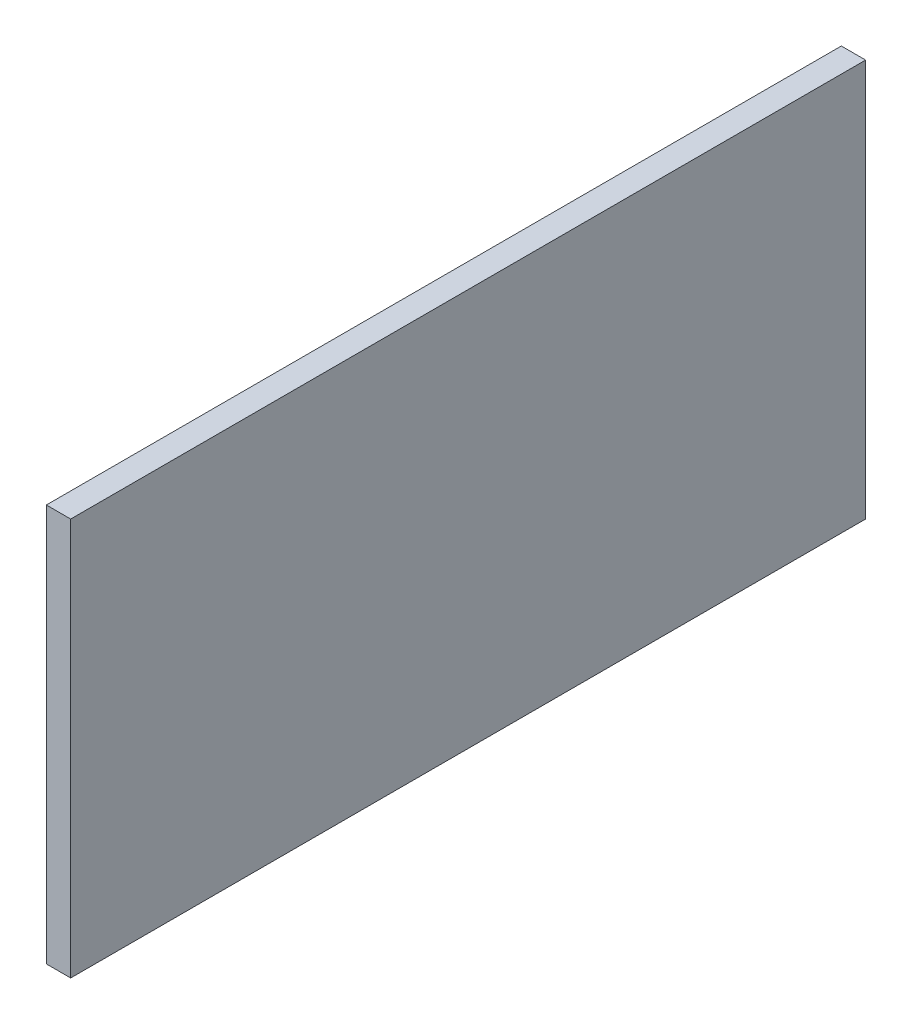
ISO-10303-21;
HEADER;
FILE_DESCRIPTION(('STEP AP214'),'2;1');
FILE_NAME('part.step','',(''),(''),'','','');
FILE_SCHEMA(('AUTOMOTIVE_DESIGN { 1 0 10303 214 1 1 1 1 }'));
ENDSEC;
DATA;
#1=APPLICATION_CONTEXT('core data for automotive mechanical design processes');
#2=APPLICATION_PROTOCOL_DEFINITION('international standard','automotive_design',2000,#1);
#3=PRODUCT_CONTEXT('',#1,'mechanical');
#4=PRODUCT('Part','Part','',(#3));
#5=PRODUCT_RELATED_PRODUCT_CATEGORY('part','',(#4));
#6=PRODUCT_DEFINITION_FORMATION('','',#4);
#7=PRODUCT_DEFINITION_CONTEXT('part definition',#1,'design');
#8=PRODUCT_DEFINITION('design','',#6,#7);
#9=PRODUCT_DEFINITION_SHAPE('','',#8);
#10=(LENGTH_UNIT() NAMED_UNIT(*) SI_UNIT(.MILLI.,.METRE.));
#11=(NAMED_UNIT(*) PLANE_ANGLE_UNIT() SI_UNIT($,.RADIAN.));
#12=(NAMED_UNIT(*) SI_UNIT($,.STERADIAN.) SOLID_ANGLE_UNIT());
#13=UNCERTAINTY_MEASURE_WITH_UNIT(LENGTH_MEASURE(1.E-05),#10,'distance_accuracy_value','');
#14=(GEOMETRIC_REPRESENTATION_CONTEXT(3) GLOBAL_UNCERTAINTY_ASSIGNED_CONTEXT((#13)) GLOBAL_UNIT_ASSIGNED_CONTEXT((#10,
#11,#12)) REPRESENTATION_CONTEXT('',''));
#15=CARTESIAN_POINT('',(0.,0.,0.));
#16=DIRECTION('',(0.,0.,1.));
#17=DIRECTION('',(1.,0.,0.));
#18=AXIS2_PLACEMENT_3D('',#15,#16,#17);
#19=CARTESIAN_POINT('',(12.2428,0.,200.));
#20=DIRECTION('',(0.,0.,-1.));
#21=DIRECTION('',(0.,1.,0.));
#22=AXIS2_PLACEMENT_3D('',#19,#20,#21);
#23=PLANE('',#22);
#24=DIRECTION('',(0.,-1.,0.));
#25=VECTOR('',#24,1.);
#26=CARTESIAN_POINT('',(0.,0.,200.));
#27=LINE('',#26,#25);
#28=CARTESIAN_POINT('',(0.,0.,200.));
#29=VERTEX_POINT('',#28);
#30=CARTESIAN_POINT('',(0.,-200.,200.));
#31=VERTEX_POINT('',#30);
#32=EDGE_CURVE('E95',#29,#31,#27,.T.);
#33=ORIENTED_EDGE('',*,*,#32,.T.);
#34=DIRECTION('',(-1.,0.,0.));
#35=VECTOR('',#34,1.);
#36=CARTESIAN_POINT('',(12.2428,-200.,200.));
#37=LINE('',#36,#35);
#38=CARTESIAN_POINT('',(12.2428,-200.,200.));
#39=VERTEX_POINT('',#38);
#40=EDGE_CURVE('E11',#39,#31,#37,.T.);
#41=ORIENTED_EDGE('',*,*,#40,.F.);
#42=DIRECTION('',(0.,-1.,0.));
#43=VECTOR('',#42,1.);
#44=CARTESIAN_POINT('',(12.2428,0.,200.));
#45=LINE('',#44,#43);
#46=CARTESIAN_POINT('',(12.2428,0.,200.));
#47=VERTEX_POINT('',#46);
#48=EDGE_CURVE('E83',#47,#39,#45,.T.);
#49=ORIENTED_EDGE('',*,*,#48,.F.);
#50=DIRECTION('',(-1.,0.,0.));
#51=VECTOR('',#50,1.);
#52=CARTESIAN_POINT('',(12.2428,0.,200.));
#53=LINE('',#52,#51);
#54=EDGE_CURVE('E91',#47,#29,#53,.T.);
#55=ORIENTED_EDGE('',*,*,#54,.T.);
#56=EDGE_LOOP('',(#33,#41,#49,#55));
#57=FACE_BOUND('',#56,.T.);
#58=ADVANCED_FACE('F32',(#57),#23,.F.);
#59=CARTESIAN_POINT('',(12.2428,-200.,200.));
#60=DIRECTION('',(0.,1.,0.));
#61=DIRECTION('',(0.,0.,1.));
#62=AXIS2_PLACEMENT_3D('',#59,#60,#61);
#63=PLANE('',#62);
#64=DIRECTION('',(0.,0.,-1.));
#65=VECTOR('',#64,1.);
#66=CARTESIAN_POINT('',(0.,-200.,200.));
#67=LINE('',#66,#65);
#68=CARTESIAN_POINT('',(0.,-200.,-200.));
#69=VERTEX_POINT('',#68);
#70=EDGE_CURVE('E87',#31,#69,#67,.T.);
#71=ORIENTED_EDGE('',*,*,#70,.T.);
#72=DIRECTION('',(-1.,0.,0.));
#73=VECTOR('',#72,1.);
#74=CARTESIAN_POINT('',(12.2428,-200.,-200.));
#75=LINE('',#74,#73);
#76=CARTESIAN_POINT('',(12.2428,-200.,-200.));
#77=VERTEX_POINT('',#76);
#78=EDGE_CURVE('E40',#77,#69,#75,.T.);
#79=ORIENTED_EDGE('',*,*,#78,.F.);
#80=DIRECTION('',(0.,0.,-1.));
#81=VECTOR('',#80,1.);
#82=CARTESIAN_POINT('',(12.2428,-200.,200.));
#83=LINE('',#82,#81);
#84=EDGE_CURVE('E78',#39,#77,#83,.T.);
#85=ORIENTED_EDGE('',*,*,#84,.F.);
#86=ORIENTED_EDGE('',*,*,#40,.T.);
#87=EDGE_LOOP('',(#71,#79,#85,#86));
#88=FACE_BOUND('',#87,.T.);
#89=ADVANCED_FACE('F86',(#88),#63,.F.);
#90=CARTESIAN_POINT('',(12.2428,0.,-200.));
#91=DIRECTION('',(0.,0.,1.));
#92=DIRECTION('',(0.,-1.,0.));
#93=AXIS2_PLACEMENT_3D('',#90,#91,#92);
#94=PLANE('',#93);
#95=DIRECTION('',(0.,1.,0.));
#96=VECTOR('',#95,1.);
#97=CARTESIAN_POINT('',(0.,0.,-200.));
#98=LINE('',#97,#96);
#99=CARTESIAN_POINT('',(0.,0.,-200.));
#100=VERTEX_POINT('',#99);
#101=EDGE_CURVE('E65',#69,#100,#98,.T.);
#102=ORIENTED_EDGE('',*,*,#101,.T.);
#103=DIRECTION('',(-1.,0.,0.));
#104=VECTOR('',#103,1.);
#105=CARTESIAN_POINT('',(12.2428,0.,-200.));
#106=LINE('',#105,#104);
#107=CARTESIAN_POINT('',(12.2428,0.,-200.));
#108=VERTEX_POINT('',#107);
#109=EDGE_CURVE('E88',#108,#100,#106,.T.);
#110=ORIENTED_EDGE('',*,*,#109,.F.);
#111=DIRECTION('',(0.,1.,0.));
#112=VECTOR('',#111,1.);
#113=CARTESIAN_POINT('',(12.2428,0.,-200.));
#114=LINE('',#113,#112);
#115=EDGE_CURVE('E81',#77,#108,#114,.T.);
#116=ORIENTED_EDGE('',*,*,#115,.F.);
#117=ORIENTED_EDGE('',*,*,#78,.T.);
#118=EDGE_LOOP('',(#102,#110,#116,#117));
#119=FACE_BOUND('',#118,.T.);
#120=ADVANCED_FACE('F89',(#119),#94,.F.);
#121=CARTESIAN_POINT('',(12.2428,0.,200.));
#122=DIRECTION('',(0.,-1.,0.));
#123=DIRECTION('',(0.,0.,-1.));
#124=AXIS2_PLACEMENT_3D('',#121,#122,#123);
#125=PLANE('',#124);
#126=DIRECTION('',(0.,0.,1.));
#127=VECTOR('',#126,1.);
#128=CARTESIAN_POINT('',(0.,0.,200.));
#129=LINE('',#128,#127);
#130=EDGE_CURVE('E71',#100,#29,#129,.T.);
#131=ORIENTED_EDGE('',*,*,#130,.T.);
#132=ORIENTED_EDGE('',*,*,#54,.F.);
#133=DIRECTION('',(0.,0.,1.));
#134=VECTOR('',#133,1.);
#135=CARTESIAN_POINT('',(12.2428,0.,200.));
#136=LINE('',#135,#134);
#137=EDGE_CURVE('E48',#108,#47,#136,.T.);
#138=ORIENTED_EDGE('',*,*,#137,.F.);
#139=ORIENTED_EDGE('',*,*,#109,.T.);
#140=EDGE_LOOP('',(#131,#132,#138,#139));
#141=FACE_BOUND('',#140,.T.);
#142=ADVANCED_FACE('F102',(#141),#125,.F.);
#143=CARTESIAN_POINT('',(12.2428,0.,0.));
#144=DIRECTION('',(1.,0.,0.));
#145=DIRECTION('',(0.,0.,-1.));
#146=AXIS2_PLACEMENT_3D('',#143,#144,#145);
#147=PLANE('',#146);
#148=ORIENTED_EDGE('',*,*,#48,.T.);
#149=ORIENTED_EDGE('',*,*,#84,.T.);
#150=ORIENTED_EDGE('',*,*,#115,.T.);
#151=ORIENTED_EDGE('',*,*,#137,.T.);
#152=EDGE_LOOP('',(#148,#149,#150,#151));
#153=FACE_BOUND('',#152,.T.);
#154=ADVANCED_FACE('F79',(#153),#147,.T.);
#155=CARTESIAN_POINT('',(0.,0.,0.));
#156=DIRECTION('',(1.,0.,0.));
#157=DIRECTION('',(0.,0.,-1.));
#158=AXIS2_PLACEMENT_3D('',#155,#156,#157);
#159=PLANE('',#158);
#160=ORIENTED_EDGE('',*,*,#32,.F.);
#161=ORIENTED_EDGE('',*,*,#130,.F.);
#162=ORIENTED_EDGE('',*,*,#101,.F.);
#163=ORIENTED_EDGE('',*,*,#70,.F.);
#164=EDGE_LOOP('',(#160,#161,#162,#163));
#165=FACE_BOUND('',#164,.T.);
#166=ADVANCED_FACE('F105',(#165),#159,.F.);
#167=CLOSED_SHELL('',(#58,#89,#120,#142,#154,#166));
#168=MANIFOLD_SOLID_BREP('B2',#167);
#169=ADVANCED_BREP_SHAPE_REPRESENTATION('',(#18,#168),#14);
#170=SHAPE_DEFINITION_REPRESENTATION(#9,#169);
ENDSEC;
END-ISO-10303-21;
